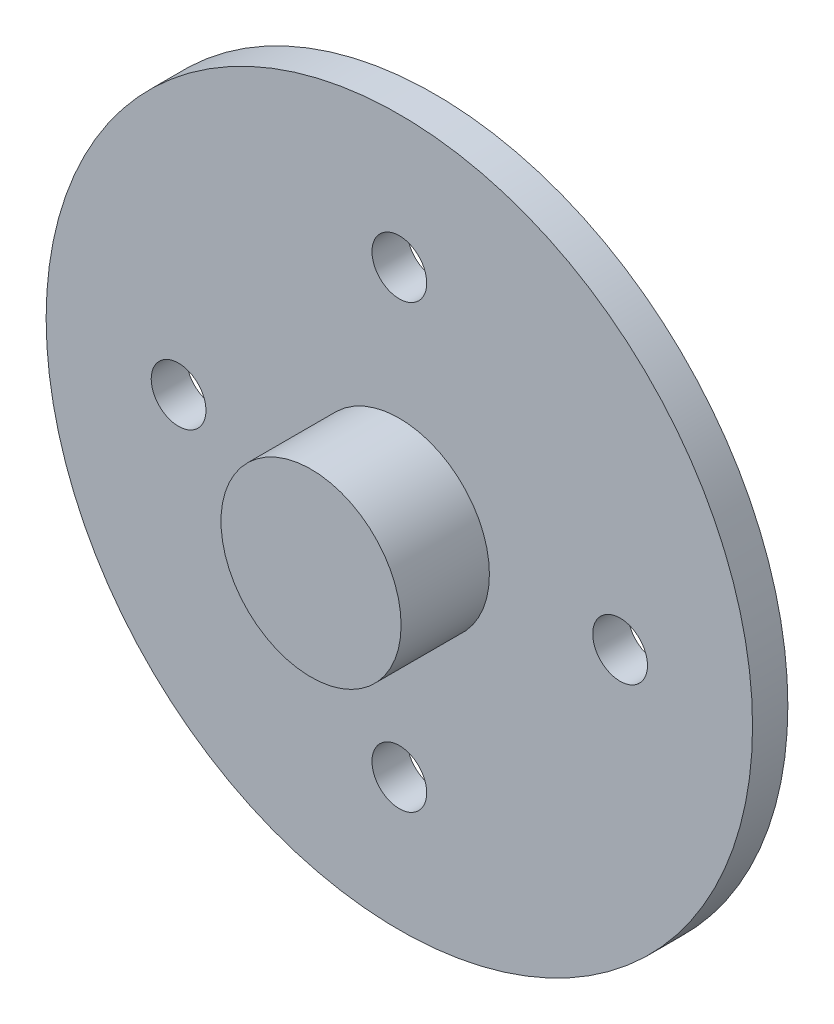
ISO-10303-21;
HEADER;
FILE_DESCRIPTION(('STEP AP214'),'2;1');
FILE_NAME('part.step','',(''),(''),'','','');
FILE_SCHEMA(('AUTOMOTIVE_DESIGN { 1 0 10303 214 1 1 1 1 }'));
ENDSEC;
DATA;
#1=APPLICATION_CONTEXT('core data for automotive mechanical design processes');
#2=APPLICATION_PROTOCOL_DEFINITION('international standard','automotive_design',2000,#1);
#3=PRODUCT_CONTEXT('',#1,'mechanical');
#4=PRODUCT('Part','Part','',(#3));
#5=PRODUCT_RELATED_PRODUCT_CATEGORY('part','',(#4));
#6=PRODUCT_DEFINITION_FORMATION('','',#4);
#7=PRODUCT_DEFINITION_CONTEXT('part definition',#1,'design');
#8=PRODUCT_DEFINITION('design','',#6,#7);
#9=PRODUCT_DEFINITION_SHAPE('','',#8);
#10=(LENGTH_UNIT() NAMED_UNIT(*) SI_UNIT(.MILLI.,.METRE.));
#11=(NAMED_UNIT(*) PLANE_ANGLE_UNIT() SI_UNIT($,.RADIAN.));
#12=(NAMED_UNIT(*) SI_UNIT($,.STERADIAN.) SOLID_ANGLE_UNIT());
#13=UNCERTAINTY_MEASURE_WITH_UNIT(LENGTH_MEASURE(1.E-05),#10,'distance_accuracy_value','');
#14=(GEOMETRIC_REPRESENTATION_CONTEXT(3) GLOBAL_UNCERTAINTY_ASSIGNED_CONTEXT((#13)) GLOBAL_UNIT_ASSIGNED_CONTEXT((#10,
#11,#12)) REPRESENTATION_CONTEXT('',''));
#15=CARTESIAN_POINT('',(0.,0.,0.));
#16=DIRECTION('',(0.,0.,1.));
#17=DIRECTION('',(1.,0.,0.));
#18=AXIS2_PLACEMENT_3D('',#15,#16,#17);
#19=CARTESIAN_POINT('',(0.,0.,2.));
#20=DIRECTION('',(0.,0.,-1.));
#21=DIRECTION('',(-1.,0.,0.));
#22=AXIS2_PLACEMENT_3D('',#19,#20,#21);
#23=CYLINDRICAL_SURFACE('',#22,20.);
#24=CARTESIAN_POINT('',(0.,0.,2.));
#25=DIRECTION('',(0.,0.,1.));
#26=DIRECTION('',(1.,0.,0.));
#27=AXIS2_PLACEMENT_3D('',#24,#25,#26);
#28=CIRCLE('',#27,20.);
#29=CARTESIAN_POINT('',(20.,0.,2.));
#30=VERTEX_POINT('',#29);
#31=EDGE_CURVE('E38',#30,#30,#28,.T.);
#32=ORIENTED_EDGE('',*,*,#31,.F.);
#33=EDGE_LOOP('',(#32));
#34=FACE_BOUND('',#33,.T.);
#35=CARTESIAN_POINT('',(0.,0.,0.));
#36=DIRECTION('',(0.,0.,1.));
#37=DIRECTION('',(1.,0.,0.));
#38=AXIS2_PLACEMENT_3D('',#35,#36,#37);
#39=CIRCLE('',#38,20.);
#40=CARTESIAN_POINT('',(20.,0.,0.));
#41=VERTEX_POINT('',#40);
#42=EDGE_CURVE('E34',#41,#41,#39,.T.);
#43=ORIENTED_EDGE('',*,*,#42,.T.);
#44=EDGE_LOOP('',(#43));
#45=FACE_BOUND('',#44,.T.);
#46=ADVANCED_FACE('F31',(#34,#45),#23,.T.);
#47=CARTESIAN_POINT('',(0.,0.,2.));
#48=DIRECTION('',(0.,0.,1.));
#49=DIRECTION('',(1.,0.,0.));
#50=AXIS2_PLACEMENT_3D('',#47,#48,#49);
#51=PLANE('',#50);
#52=CARTESIAN_POINT('',(0.,12.5,2.));
#53=DIRECTION('',(0.,0.,1.));
#54=DIRECTION('',(0.,1.,0.));
#55=AXIS2_PLACEMENT_3D('',#52,#53,#54);
#56=CIRCLE('',#55,1.55);
#57=CARTESIAN_POINT('',(0.,14.05,2.));
#58=VERTEX_POINT('',#57);
#59=EDGE_CURVE('E66',#58,#58,#56,.T.);
#60=ORIENTED_EDGE('',*,*,#59,.F.);
#61=EDGE_LOOP('',(#60));
#62=FACE_BOUND('',#61,.T.);
#63=CARTESIAN_POINT('',(-12.5,0.,2.));
#64=DIRECTION('',(0.,0.,1.));
#65=DIRECTION('',(-1.,0.,0.));
#66=AXIS2_PLACEMENT_3D('',#63,#64,#65);
#67=CIRCLE('',#66,1.55);
#68=CARTESIAN_POINT('',(-14.05,0.,2.));
#69=VERTEX_POINT('',#68);
#70=EDGE_CURVE('E60',#69,#69,#67,.T.);
#71=ORIENTED_EDGE('',*,*,#70,.F.);
#72=EDGE_LOOP('',(#71));
#73=FACE_BOUND('',#72,.T.);
#74=CARTESIAN_POINT('',(1.30930550206618E-13,-12.5,2.));
#75=DIRECTION('',(0.,0.,1.));
#76=DIRECTION('',(0.,-1.,0.));
#77=AXIS2_PLACEMENT_3D('',#74,#75,#76);
#78=CIRCLE('',#77,1.55);
#79=CARTESIAN_POINT('',(1.47165938432238E-13,-14.05,2.));
#80=VERTEX_POINT('',#79);
#81=EDGE_CURVE('E54',#80,#80,#78,.T.);
#82=ORIENTED_EDGE('',*,*,#81,.F.);
#83=EDGE_LOOP('',(#82));
#84=FACE_BOUND('',#83,.T.);
#85=CARTESIAN_POINT('',(12.5,0.,2.));
#86=DIRECTION('',(0.,0.,1.));
#87=DIRECTION('',(1.,0.,0.));
#88=AXIS2_PLACEMENT_3D('',#85,#86,#87);
#89=CIRCLE('',#88,1.55);
#90=CARTESIAN_POINT('',(14.05,0.,2.));
#91=VERTEX_POINT('',#90);
#92=EDGE_CURVE('E48',#91,#91,#89,.T.);
#93=ORIENTED_EDGE('',*,*,#92,.F.);
#94=EDGE_LOOP('',(#93));
#95=FACE_BOUND('',#94,.T.);
#96=CARTESIAN_POINT('',(0.,0.,2.));
#97=DIRECTION('',(0.,0.,1.));
#98=DIRECTION('',(1.,0.,0.));
#99=AXIS2_PLACEMENT_3D('',#96,#97,#98);
#100=CIRCLE('',#99,5.1);
#101=CARTESIAN_POINT('',(5.1,0.,2.));
#102=VERTEX_POINT('',#101);
#103=EDGE_CURVE('E10',#102,#102,#100,.T.);
#104=ORIENTED_EDGE('',*,*,#103,.F.);
#105=EDGE_LOOP('',(#104));
#106=FACE_BOUND('',#105,.T.);
#107=ORIENTED_EDGE('',*,*,#31,.T.);
#108=EDGE_LOOP('',(#107));
#109=FACE_BOUND('',#108,.T.);
#110=ADVANCED_FACE('F82',(#62,#73,#84,#95,#106,#109),#51,.T.);
#111=CARTESIAN_POINT('',(0.,0.,0.));
#112=DIRECTION('',(0.,0.,1.));
#113=DIRECTION('',(1.,0.,0.));
#114=AXIS2_PLACEMENT_3D('',#111,#112,#113);
#115=PLANE('',#114);
#116=CARTESIAN_POINT('',(0.,12.5,0.));
#117=DIRECTION('',(0.,0.,1.));
#118=DIRECTION('',(0.,1.,0.));
#119=AXIS2_PLACEMENT_3D('',#116,#117,#118);
#120=CIRCLE('',#119,1.55);
#121=CARTESIAN_POINT('',(0.,14.05,0.));
#122=VERTEX_POINT('',#121);
#123=EDGE_CURVE('E51',#122,#122,#120,.T.);
#124=ORIENTED_EDGE('',*,*,#123,.T.);
#125=EDGE_LOOP('',(#124));
#126=FACE_BOUND('',#125,.T.);
#127=CARTESIAN_POINT('',(-12.5,0.,0.));
#128=DIRECTION('',(0.,0.,1.));
#129=DIRECTION('',(-1.,0.,0.));
#130=AXIS2_PLACEMENT_3D('',#127,#128,#129);
#131=CIRCLE('',#130,1.55);
#132=CARTESIAN_POINT('',(-14.05,0.,0.));
#133=VERTEX_POINT('',#132);
#134=EDGE_CURVE('E63',#133,#133,#131,.T.);
#135=ORIENTED_EDGE('',*,*,#134,.T.);
#136=EDGE_LOOP('',(#135));
#137=FACE_BOUND('',#136,.T.);
#138=CARTESIAN_POINT('',(1.30930550206618E-13,-12.5,0.));
#139=DIRECTION('',(0.,0.,1.));
#140=DIRECTION('',(0.,-1.,0.));
#141=AXIS2_PLACEMENT_3D('',#138,#139,#140);
#142=CIRCLE('',#141,1.55);
#143=CARTESIAN_POINT('',(1.47165938432238E-13,-14.05,0.));
#144=VERTEX_POINT('',#143);
#145=EDGE_CURVE('E57',#144,#144,#142,.T.);
#146=ORIENTED_EDGE('',*,*,#145,.T.);
#147=EDGE_LOOP('',(#146));
#148=FACE_BOUND('',#147,.T.);
#149=CARTESIAN_POINT('',(12.5,0.,0.));
#150=DIRECTION('',(0.,0.,1.));
#151=DIRECTION('',(1.,0.,0.));
#152=AXIS2_PLACEMENT_3D('',#149,#150,#151);
#153=CIRCLE('',#152,1.55);
#154=CARTESIAN_POINT('',(14.05,0.,0.));
#155=VERTEX_POINT('',#154);
#156=EDGE_CURVE('E47',#155,#155,#153,.T.);
#157=ORIENTED_EDGE('',*,*,#156,.T.);
#158=EDGE_LOOP('',(#157));
#159=FACE_BOUND('',#158,.T.);
#160=ORIENTED_EDGE('',*,*,#42,.F.);
#161=EDGE_LOOP('',(#160));
#162=FACE_BOUND('',#161,.T.);
#163=ADVANCED_FACE('F72',(#126,#137,#148,#159,#162),#115,.F.);
#164=CARTESIAN_POINT('',(0.,0.,7.));
#165=DIRECTION('',(0.,0.,-1.));
#166=DIRECTION('',(-1.,0.,0.));
#167=AXIS2_PLACEMENT_3D('',#164,#165,#166);
#168=CYLINDRICAL_SURFACE('',#167,5.1);
#169=CARTESIAN_POINT('',(0.,0.,7.));
#170=DIRECTION('',(0.,0.,1.));
#171=DIRECTION('',(1.,0.,0.));
#172=AXIS2_PLACEMENT_3D('',#169,#170,#171);
#173=CIRCLE('',#172,5.1);
#174=CARTESIAN_POINT('',(5.1,0.,7.));
#175=VERTEX_POINT('',#174);
#176=EDGE_CURVE('E44',#175,#175,#173,.T.);
#177=ORIENTED_EDGE('',*,*,#176,.F.);
#178=EDGE_LOOP('',(#177));
#179=FACE_BOUND('',#178,.T.);
#180=ORIENTED_EDGE('',*,*,#103,.T.);
#181=EDGE_LOOP('',(#180));
#182=FACE_BOUND('',#181,.T.);
#183=ADVANCED_FACE('F101',(#179,#182),#168,.T.);
#184=CARTESIAN_POINT('',(0.,0.,7.));
#185=DIRECTION('',(0.,0.,1.));
#186=DIRECTION('',(1.,0.,0.));
#187=AXIS2_PLACEMENT_3D('',#184,#185,#186);
#188=PLANE('',#187);
#189=ORIENTED_EDGE('',*,*,#176,.T.);
#190=EDGE_LOOP('',(#189));
#191=FACE_BOUND('',#190,.T.);
#192=ADVANCED_FACE('F105',(#191),#188,.T.);
#193=CARTESIAN_POINT('',(12.5,0.,0.));
#194=DIRECTION('',(0.,0.,1.));
#195=DIRECTION('',(1.,0.,0.));
#196=AXIS2_PLACEMENT_3D('',#193,#194,#195);
#197=CYLINDRICAL_SURFACE('',#196,1.55);
#198=ORIENTED_EDGE('',*,*,#156,.F.);
#199=EDGE_LOOP('',(#198));
#200=FACE_BOUND('',#199,.T.);
#201=ORIENTED_EDGE('',*,*,#92,.T.);
#202=EDGE_LOOP('',(#201));
#203=FACE_BOUND('',#202,.T.);
#204=ADVANCED_FACE('F111',(#200,#203),#197,.F.);
#205=CARTESIAN_POINT('',(1.30930550206618E-13,-12.5,0.));
#206=DIRECTION('',(0.,0.,1.));
#207=DIRECTION('',(1.,0.,0.));
#208=AXIS2_PLACEMENT_3D('',#205,#206,#207);
#209=CYLINDRICAL_SURFACE('',#208,1.55);
#210=ORIENTED_EDGE('',*,*,#145,.F.);
#211=EDGE_LOOP('',(#210));
#212=FACE_BOUND('',#211,.T.);
#213=ORIENTED_EDGE('',*,*,#81,.T.);
#214=EDGE_LOOP('',(#213));
#215=FACE_BOUND('',#214,.T.);
#216=ADVANCED_FACE('F115',(#212,#215),#209,.F.);
#217=CARTESIAN_POINT('',(-12.5,0.,0.));
#218=DIRECTION('',(0.,0.,1.));
#219=DIRECTION('',(1.,0.,0.));
#220=AXIS2_PLACEMENT_3D('',#217,#218,#219);
#221=CYLINDRICAL_SURFACE('',#220,1.55);
#222=ORIENTED_EDGE('',*,*,#134,.F.);
#223=EDGE_LOOP('',(#222));
#224=FACE_BOUND('',#223,.T.);
#225=ORIENTED_EDGE('',*,*,#70,.T.);
#226=EDGE_LOOP('',(#225));
#227=FACE_BOUND('',#226,.T.);
#228=ADVANCED_FACE('F78',(#224,#227),#221,.F.);
#229=CARTESIAN_POINT('',(0.,12.5,0.));
#230=DIRECTION('',(0.,0.,1.));
#231=DIRECTION('',(1.,0.,0.));
#232=AXIS2_PLACEMENT_3D('',#229,#230,#231);
#233=CYLINDRICAL_SURFACE('',#232,1.55);
#234=ORIENTED_EDGE('',*,*,#123,.F.);
#235=EDGE_LOOP('',(#234));
#236=FACE_BOUND('',#235,.T.);
#237=ORIENTED_EDGE('',*,*,#59,.T.);
#238=EDGE_LOOP('',(#237));
#239=FACE_BOUND('',#238,.T.);
#240=ADVANCED_FACE('F75',(#236,#239),#233,.F.);
#241=CLOSED_SHELL('',(#46,#110,#163,#183,#192,#204,#216,#228,#240));
#242=MANIFOLD_SOLID_BREP('B2',#241);
#243=ADVANCED_BREP_SHAPE_REPRESENTATION('',(#18,#242),#14);
#244=SHAPE_DEFINITION_REPRESENTATION(#9,#243);
ENDSEC;
END-ISO-10303-21;
